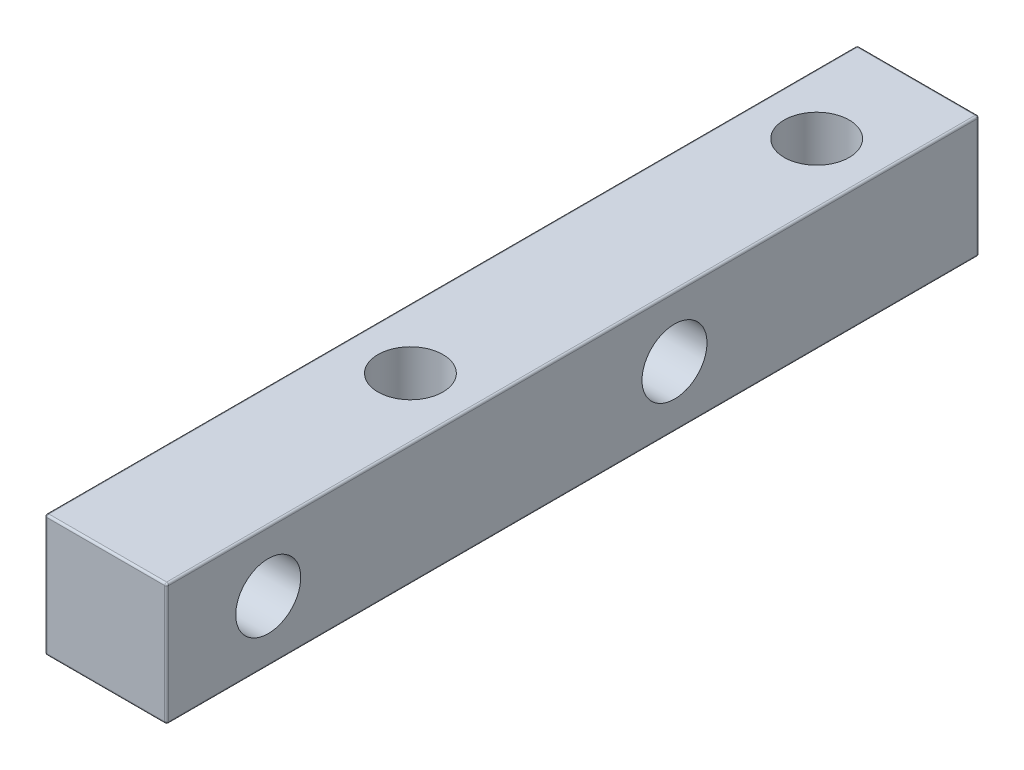
ISO-10303-21;
HEADER;
FILE_DESCRIPTION(('STEP AP214'),'2;1');
FILE_NAME('part.step','',(''),(''),'','','');
FILE_SCHEMA(('AUTOMOTIVE_DESIGN { 1 0 10303 214 1 1 1 1 }'));
ENDSEC;
DATA;
#1=APPLICATION_CONTEXT('core data for automotive mechanical design processes');
#2=APPLICATION_PROTOCOL_DEFINITION('international standard','automotive_design',2000,#1);
#3=PRODUCT_CONTEXT('',#1,'mechanical');
#4=PRODUCT('Part','Part','',(#3));
#5=PRODUCT_RELATED_PRODUCT_CATEGORY('part','',(#4));
#6=PRODUCT_DEFINITION_FORMATION('','',#4);
#7=PRODUCT_DEFINITION_CONTEXT('part definition',#1,'design');
#8=PRODUCT_DEFINITION('design','',#6,#7);
#9=PRODUCT_DEFINITION_SHAPE('','',#8);
#10=(LENGTH_UNIT() NAMED_UNIT(*) SI_UNIT(.MILLI.,.METRE.));
#11=(NAMED_UNIT(*) PLANE_ANGLE_UNIT() SI_UNIT($,.RADIAN.));
#12=(NAMED_UNIT(*) SI_UNIT($,.STERADIAN.) SOLID_ANGLE_UNIT());
#13=UNCERTAINTY_MEASURE_WITH_UNIT(LENGTH_MEASURE(1.E-05),#10,'distance_accuracy_value','');
#14=(GEOMETRIC_REPRESENTATION_CONTEXT(3) GLOBAL_UNCERTAINTY_ASSIGNED_CONTEXT((#13)) GLOBAL_UNIT_ASSIGNED_CONTEXT((#10,
#11,#12)) REPRESENTATION_CONTEXT('',''));
#15=CARTESIAN_POINT('',(0.,0.,0.));
#16=DIRECTION('',(0.,0.,1.));
#17=DIRECTION('',(1.,0.,0.));
#18=AXIS2_PLACEMENT_3D('',#15,#16,#17);
#19=CARTESIAN_POINT('',(3.,3.,40.));
#20=DIRECTION('',(-1.,0.,0.));
#21=DIRECTION('',(0.,-1.,0.));
#22=AXIS2_PLACEMENT_3D('',#19,#20,#21);
#23=PLANE('',#22);
#24=DIRECTION('',(0.,1.,0.));
#25=VECTOR('',#24,1.);
#26=CARTESIAN_POINT('',(3.,-3.,39.9));
#27=LINE('',#26,#25);
#28=CARTESIAN_POINT('',(3.,2.9,39.9));
#29=VERTEX_POINT('',#28);
#30=CARTESIAN_POINT('',(3.,-2.9,39.9));
#31=VERTEX_POINT('',#30);
#32=EDGE_CURVE('E162',#29,#31,#27,.F.);
#33=ORIENTED_EDGE('',*,*,#32,.T.);
#34=DIRECTION('',(0.,0.,-1.));
#35=VECTOR('',#34,1.);
#36=CARTESIAN_POINT('',(3.,-2.9,40.));
#37=LINE('',#36,#35);
#38=CARTESIAN_POINT('',(3.,-2.9,0.100000000000003));
#39=VERTEX_POINT('',#38);
#40=EDGE_CURVE('E167',#31,#39,#37,.T.);
#41=ORIENTED_EDGE('',*,*,#40,.T.);
#42=DIRECTION('',(0.,1.,0.));
#43=VECTOR('',#42,1.);
#44=CARTESIAN_POINT('',(3.,3.,0.100000000000003));
#45=LINE('',#44,#43);
#46=CARTESIAN_POINT('',(3.,2.9,0.100000000000003));
#47=VERTEX_POINT('',#46);
#48=EDGE_CURVE('E136',#39,#47,#45,.T.);
#49=ORIENTED_EDGE('',*,*,#48,.T.);
#50=DIRECTION('',(0.,0.,-1.));
#51=VECTOR('',#50,1.);
#52=CARTESIAN_POINT('',(3.,2.9,40.));
#53=LINE('',#52,#51);
#54=EDGE_CURVE('E156',#47,#29,#53,.F.);
#55=ORIENTED_EDGE('',*,*,#54,.T.);
#56=EDGE_LOOP('',(#33,#41,#49,#55));
#57=FACE_BOUND('',#56,.T.);
#58=CARTESIAN_POINT('',(3.,0.,15.));
#59=DIRECTION('',(-1.,0.,0.));
#60=DIRECTION('',(0.,-1.,0.));
#61=AXIS2_PLACEMENT_3D('',#58,#59,#60);
#62=CIRCLE('',#61,1.6);
#63=CARTESIAN_POINT('',(3.,-1.6,15.));
#64=VERTEX_POINT('',#63);
#65=EDGE_CURVE('E163',#64,#64,#62,.T.);
#66=ORIENTED_EDGE('',*,*,#65,.T.);
#67=EDGE_LOOP('',(#66));
#68=FACE_BOUND('',#67,.T.);
#69=CARTESIAN_POINT('',(3.,0.,35.));
#70=DIRECTION('',(-1.,0.,0.));
#71=DIRECTION('',(0.,-1.,0.));
#72=AXIS2_PLACEMENT_3D('',#69,#70,#71);
#73=CIRCLE('',#72,1.6);
#74=CARTESIAN_POINT('',(3.,-1.6,35.));
#75=VERTEX_POINT('',#74);
#76=EDGE_CURVE('E329',#75,#75,#73,.T.);
#77=ORIENTED_EDGE('',*,*,#76,.T.);
#78=EDGE_LOOP('',(#77));
#79=FACE_BOUND('',#78,.T.);
#80=ADVANCED_FACE('F38',(#57,#68,#79),#23,.F.);
#81=CARTESIAN_POINT('',(-3.,3.,40.));
#82=DIRECTION('',(0.,-1.,0.));
#83=DIRECTION('',(0.,0.,-1.));
#84=AXIS2_PLACEMENT_3D('',#81,#82,#83);
#85=PLANE('',#84);
#86=DIRECTION('',(-1.,0.,0.));
#87=VECTOR('',#86,1.);
#88=CARTESIAN_POINT('',(3.,3.,39.9));
#89=LINE('',#88,#87);
#90=CARTESIAN_POINT('',(-2.9,3.,39.9));
#91=VERTEX_POINT('',#90);
#92=CARTESIAN_POINT('',(2.9,3.,39.9));
#93=VERTEX_POINT('',#92);
#94=EDGE_CURVE('E190',#91,#93,#89,.F.);
#95=ORIENTED_EDGE('',*,*,#94,.T.);
#96=DIRECTION('',(0.,0.,-1.));
#97=VECTOR('',#96,1.);
#98=CARTESIAN_POINT('',(2.9,3.,40.));
#99=LINE('',#98,#97);
#100=CARTESIAN_POINT('',(2.9,3.,0.100000000000003));
#101=VERTEX_POINT('',#100);
#102=EDGE_CURVE('E197',#93,#101,#99,.T.);
#103=ORIENTED_EDGE('',*,*,#102,.T.);
#104=DIRECTION('',(-1.,0.,0.));
#105=VECTOR('',#104,1.);
#106=CARTESIAN_POINT('',(-3.,3.,0.100000000000003));
#107=LINE('',#106,#105);
#108=CARTESIAN_POINT('',(-2.9,3.,0.100000000000003));
#109=VERTEX_POINT('',#108);
#110=EDGE_CURVE('E193',#101,#109,#107,.T.);
#111=ORIENTED_EDGE('',*,*,#110,.T.);
#112=DIRECTION('',(0.,0.,-1.));
#113=VECTOR('',#112,1.);
#114=CARTESIAN_POINT('',(-2.9,3.,40.));
#115=LINE('',#114,#113);
#116=EDGE_CURVE('E187',#109,#91,#115,.F.);
#117=ORIENTED_EDGE('',*,*,#116,.T.);
#118=EDGE_LOOP('',(#95,#103,#111,#117));
#119=FACE_BOUND('',#118,.T.);
#120=CARTESIAN_POINT('',(0.,3.,5.));
#121=DIRECTION('',(0.,1.,0.));
#122=DIRECTION('',(0.,0.,1.));
#123=AXIS2_PLACEMENT_3D('',#120,#121,#122);
#124=CIRCLE('',#123,1.6);
#125=CARTESIAN_POINT('',(0.,3.,6.6));
#126=VERTEX_POINT('',#125);
#127=EDGE_CURVE('E316',#126,#126,#124,.T.);
#128=ORIENTED_EDGE('',*,*,#127,.F.);
#129=EDGE_LOOP('',(#128));
#130=FACE_BOUND('',#129,.T.);
#131=CARTESIAN_POINT('',(0.,3.,25.));
#132=DIRECTION('',(0.,1.,0.));
#133=DIRECTION('',(0.,0.,1.));
#134=AXIS2_PLACEMENT_3D('',#131,#132,#133);
#135=CIRCLE('',#134,1.6);
#136=CARTESIAN_POINT('',(0.,3.,26.6));
#137=VERTEX_POINT('',#136);
#138=EDGE_CURVE('E309',#137,#137,#135,.T.);
#139=ORIENTED_EDGE('',*,*,#138,.F.);
#140=EDGE_LOOP('',(#139));
#141=FACE_BOUND('',#140,.T.);
#142=ADVANCED_FACE('F365',(#119,#130,#141),#85,.F.);
#143=CARTESIAN_POINT('',(-3.,3.,40.));
#144=DIRECTION('',(1.,0.,0.));
#145=DIRECTION('',(0.,1.,0.));
#146=AXIS2_PLACEMENT_3D('',#143,#144,#145);
#147=PLANE('',#146);
#148=DIRECTION('',(0.,-1.,0.));
#149=VECTOR('',#148,1.);
#150=CARTESIAN_POINT('',(-3.,3.,0.100000000000003));
#151=LINE('',#150,#149);
#152=CARTESIAN_POINT('',(-3.,2.9,0.100000000000003));
#153=VERTEX_POINT('',#152);
#154=CARTESIAN_POINT('',(-3.,-2.9,0.100000000000003));
#155=VERTEX_POINT('',#154);
#156=EDGE_CURVE('E206',#153,#155,#151,.T.);
#157=ORIENTED_EDGE('',*,*,#156,.T.);
#158=DIRECTION('',(0.,0.,-1.));
#159=VECTOR('',#158,1.);
#160=CARTESIAN_POINT('',(-3.,-2.9,40.));
#161=LINE('',#160,#159);
#162=CARTESIAN_POINT('',(-3.,-2.9,39.9));
#163=VERTEX_POINT('',#162);
#164=EDGE_CURVE('E210',#155,#163,#161,.F.);
#165=ORIENTED_EDGE('',*,*,#164,.T.);
#166=DIRECTION('',(0.,-1.,0.));
#167=VECTOR('',#166,1.);
#168=CARTESIAN_POINT('',(-3.,3.,39.9));
#169=LINE('',#168,#167);
#170=CARTESIAN_POINT('',(-3.,2.9,39.9));
#171=VERTEX_POINT('',#170);
#172=EDGE_CURVE('E203',#163,#171,#169,.F.);
#173=ORIENTED_EDGE('',*,*,#172,.T.);
#174=DIRECTION('',(0.,0.,-1.));
#175=VECTOR('',#174,1.);
#176=CARTESIAN_POINT('',(-3.,2.9,40.));
#177=LINE('',#176,#175);
#178=EDGE_CURVE('E200',#171,#153,#177,.T.);
#179=ORIENTED_EDGE('',*,*,#178,.T.);
#180=EDGE_LOOP('',(#157,#165,#173,#179));
#181=FACE_BOUND('',#180,.T.);
#182=CARTESIAN_POINT('',(-3.,0.,15.));
#183=DIRECTION('',(-1.,0.,0.));
#184=DIRECTION('',(0.,-1.,0.));
#185=AXIS2_PLACEMENT_3D('',#182,#183,#184);
#186=CIRCLE('',#185,1.6);
#187=CARTESIAN_POINT('',(-3.,-1.6,15.));
#188=VERTEX_POINT('',#187);
#189=EDGE_CURVE('E325',#188,#188,#186,.T.);
#190=ORIENTED_EDGE('',*,*,#189,.F.);
#191=EDGE_LOOP('',(#190));
#192=FACE_BOUND('',#191,.T.);
#193=CARTESIAN_POINT('',(-3.,0.,35.));
#194=DIRECTION('',(-1.,0.,0.));
#195=DIRECTION('',(0.,-1.,0.));
#196=AXIS2_PLACEMENT_3D('',#193,#194,#195);
#197=CIRCLE('',#196,1.6);
#198=CARTESIAN_POINT('',(-3.,-1.6,35.));
#199=VERTEX_POINT('',#198);
#200=EDGE_CURVE('E330',#199,#199,#197,.T.);
#201=ORIENTED_EDGE('',*,*,#200,.F.);
#202=EDGE_LOOP('',(#201));
#203=FACE_BOUND('',#202,.T.);
#204=ADVANCED_FACE('F370',(#181,#192,#203),#147,.F.);
#205=CARTESIAN_POINT('',(-3.,-3.,40.));
#206=DIRECTION('',(0.,1.,0.));
#207=DIRECTION('',(0.,0.,1.));
#208=AXIS2_PLACEMENT_3D('',#205,#206,#207);
#209=PLANE('',#208);
#210=DIRECTION('',(1.,0.,0.));
#211=VECTOR('',#210,1.);
#212=CARTESIAN_POINT('',(-3.,-3.,0.100000000000003));
#213=LINE('',#212,#211);
#214=CARTESIAN_POINT('',(-2.9,-3.,0.100000000000003));
#215=VERTEX_POINT('',#214);
#216=CARTESIAN_POINT('',(2.9,-3.,0.100000000000003));
#217=VERTEX_POINT('',#216);
#218=EDGE_CURVE('E219',#215,#217,#213,.T.);
#219=ORIENTED_EDGE('',*,*,#218,.T.);
#220=DIRECTION('',(0.,0.,-1.));
#221=VECTOR('',#220,1.);
#222=CARTESIAN_POINT('',(2.9,-3.,40.));
#223=LINE('',#222,#221);
#224=CARTESIAN_POINT('',(2.9,-3.,39.9));
#225=VERTEX_POINT('',#224);
#226=EDGE_CURVE('E223',#217,#225,#223,.F.);
#227=ORIENTED_EDGE('',*,*,#226,.T.);
#228=DIRECTION('',(1.,0.,0.));
#229=VECTOR('',#228,1.);
#230=CARTESIAN_POINT('',(-3.,-3.,39.9));
#231=LINE('',#230,#229);
#232=CARTESIAN_POINT('',(-2.9,-3.,39.9));
#233=VERTEX_POINT('',#232);
#234=EDGE_CURVE('E216',#225,#233,#231,.F.);
#235=ORIENTED_EDGE('',*,*,#234,.T.);
#236=DIRECTION('',(0.,0.,-1.));
#237=VECTOR('',#236,1.);
#238=CARTESIAN_POINT('',(-2.9,-3.,40.));
#239=LINE('',#238,#237);
#240=EDGE_CURVE('E213',#233,#215,#239,.T.);
#241=ORIENTED_EDGE('',*,*,#240,.T.);
#242=EDGE_LOOP('',(#219,#227,#235,#241));
#243=FACE_BOUND('',#242,.T.);
#244=CARTESIAN_POINT('',(0.,-3.,5.));
#245=DIRECTION('',(0.,1.,0.));
#246=DIRECTION('',(0.,0.,1.));
#247=AXIS2_PLACEMENT_3D('',#244,#245,#246);
#248=CIRCLE('',#247,1.6);
#249=CARTESIAN_POINT('',(0.,-3.,6.6));
#250=VERTEX_POINT('',#249);
#251=EDGE_CURVE('E334',#250,#250,#248,.T.);
#252=ORIENTED_EDGE('',*,*,#251,.T.);
#253=EDGE_LOOP('',(#252));
#254=FACE_BOUND('',#253,.T.);
#255=CARTESIAN_POINT('',(0.,-3.,25.));
#256=DIRECTION('',(0.,1.,0.));
#257=DIRECTION('',(0.,0.,1.));
#258=AXIS2_PLACEMENT_3D('',#255,#256,#257);
#259=CIRCLE('',#258,1.6);
#260=CARTESIAN_POINT('',(0.,-3.,26.6));
#261=VERTEX_POINT('',#260);
#262=EDGE_CURVE('E322',#261,#261,#259,.T.);
#263=ORIENTED_EDGE('',*,*,#262,.T.);
#264=EDGE_LOOP('',(#263));
#265=FACE_BOUND('',#264,.T.);
#266=ADVANCED_FACE('F348',(#243,#254,#265),#209,.F.);
#267=CARTESIAN_POINT('',(0.,0.,40.));
#268=DIRECTION('',(0.,0.,1.));
#269=DIRECTION('',(1.,0.,0.));
#270=AXIS2_PLACEMENT_3D('',#267,#268,#269);
#271=PLANE('',#270);
#272=DIRECTION('',(1.,0.,0.));
#273=VECTOR('',#272,1.);
#274=CARTESIAN_POINT('',(3.,-2.9,40.));
#275=LINE('',#274,#273);
#276=CARTESIAN_POINT('',(-2.9,-2.9,40.));
#277=VERTEX_POINT('',#276);
#278=CARTESIAN_POINT('',(2.9,-2.9,40.));
#279=VERTEX_POINT('',#278);
#280=EDGE_CURVE('E226',#277,#279,#275,.T.);
#281=ORIENTED_EDGE('',*,*,#280,.T.);
#282=DIRECTION('',(0.,1.,0.));
#283=VECTOR('',#282,1.);
#284=CARTESIAN_POINT('',(2.9,3.,40.));
#285=LINE('',#284,#283);
#286=CARTESIAN_POINT('',(2.9,2.9,40.));
#287=VERTEX_POINT('',#286);
#288=EDGE_CURVE('E11',#279,#287,#285,.T.);
#289=ORIENTED_EDGE('',*,*,#288,.T.);
#290=DIRECTION('',(-1.,0.,0.));
#291=VECTOR('',#290,1.);
#292=CARTESIAN_POINT('',(-3.,2.9,40.));
#293=LINE('',#292,#291);
#294=CARTESIAN_POINT('',(-2.9,2.9,40.));
#295=VERTEX_POINT('',#294);
#296=EDGE_CURVE('E48',#287,#295,#293,.T.);
#297=ORIENTED_EDGE('',*,*,#296,.T.);
#298=DIRECTION('',(0.,-1.,0.));
#299=VECTOR('',#298,1.);
#300=CARTESIAN_POINT('',(-2.9,-3.,40.));
#301=LINE('',#300,#299);
#302=EDGE_CURVE('E229',#295,#277,#301,.T.);
#303=ORIENTED_EDGE('',*,*,#302,.T.);
#304=EDGE_LOOP('',(#281,#289,#297,#303));
#305=FACE_BOUND('',#304,.T.);
#306=ADVANCED_FACE('F446',(#305),#271,.T.);
#307=CARTESIAN_POINT('',(0.,0.,0.));
#308=DIRECTION('',(0.,0.,1.));
#309=DIRECTION('',(1.,0.,0.));
#310=AXIS2_PLACEMENT_3D('',#307,#308,#309);
#311=PLANE('',#310);
#312=DIRECTION('',(-1.,0.,0.));
#313=VECTOR('',#312,1.);
#314=CARTESIAN_POINT('',(0.,2.9,0.));
#315=LINE('',#314,#313);
#316=CARTESIAN_POINT('',(-2.9,2.9,0.));
#317=VERTEX_POINT('',#316);
#318=CARTESIAN_POINT('',(2.9,2.9,0.));
#319=VERTEX_POINT('',#318);
#320=EDGE_CURVE('E182',#317,#319,#315,.F.);
#321=ORIENTED_EDGE('',*,*,#320,.T.);
#322=DIRECTION('',(0.,1.,0.));
#323=VECTOR('',#322,1.);
#324=CARTESIAN_POINT('',(2.9,0.,0.));
#325=LINE('',#324,#323);
#326=CARTESIAN_POINT('',(2.9,-2.9,0.));
#327=VERTEX_POINT('',#326);
#328=EDGE_CURVE('E138',#319,#327,#325,.F.);
#329=ORIENTED_EDGE('',*,*,#328,.T.);
#330=DIRECTION('',(1.,0.,0.));
#331=VECTOR('',#330,1.);
#332=CARTESIAN_POINT('',(0.,-2.9,0.));
#333=LINE('',#332,#331);
#334=CARTESIAN_POINT('',(-2.9,-2.9,0.));
#335=VERTEX_POINT('',#334);
#336=EDGE_CURVE('E173',#327,#335,#333,.F.);
#337=ORIENTED_EDGE('',*,*,#336,.T.);
#338=DIRECTION('',(0.,-1.,0.));
#339=VECTOR('',#338,1.);
#340=CARTESIAN_POINT('',(-2.9,0.,0.));
#341=LINE('',#340,#339);
#342=EDGE_CURVE('E179',#335,#317,#341,.F.);
#343=ORIENTED_EDGE('',*,*,#342,.T.);
#344=EDGE_LOOP('',(#321,#329,#337,#343));
#345=FACE_BOUND('',#344,.T.);
#346=ADVANCED_FACE('F471',(#345),#311,.F.);
#347=CARTESIAN_POINT('',(37.,0.,35.));
#348=DIRECTION('',(-1.,0.,0.));
#349=DIRECTION('',(0.,-1.,0.));
#350=AXIS2_PLACEMENT_3D('',#347,#348,#349);
#351=CYLINDRICAL_SURFACE('',#350,1.6);
#352=ORIENTED_EDGE('',*,*,#200,.T.);
#353=EDGE_LOOP('',(#352));
#354=FACE_BOUND('',#353,.T.);
#355=ORIENTED_EDGE('',*,*,#76,.F.);
#356=EDGE_LOOP('',(#355));
#357=FACE_BOUND('',#356,.T.);
#358=ADVANCED_FACE('F478',(#354,#357),#351,.F.);
#359=CARTESIAN_POINT('',(37.,0.,15.));
#360=DIRECTION('',(-1.,0.,0.));
#361=DIRECTION('',(0.,-1.,0.));
#362=AXIS2_PLACEMENT_3D('',#359,#360,#361);
#363=CYLINDRICAL_SURFACE('',#362,1.6);
#364=ORIENTED_EDGE('',*,*,#189,.T.);
#365=EDGE_LOOP('',(#364));
#366=FACE_BOUND('',#365,.T.);
#367=ORIENTED_EDGE('',*,*,#65,.F.);
#368=EDGE_LOOP('',(#367));
#369=FACE_BOUND('',#368,.T.);
#370=ADVANCED_FACE('F362',(#366,#369),#363,.F.);
#371=CARTESIAN_POINT('',(0.,-37.,25.));
#372=DIRECTION('',(0.,1.,0.));
#373=DIRECTION('',(0.,0.,1.));
#374=AXIS2_PLACEMENT_3D('',#371,#372,#373);
#375=CYLINDRICAL_SURFACE('',#374,1.6);
#376=ORIENTED_EDGE('',*,*,#138,.T.);
#377=EDGE_LOOP('',(#376));
#378=FACE_BOUND('',#377,.T.);
#379=ORIENTED_EDGE('',*,*,#262,.F.);
#380=EDGE_LOOP('',(#379));
#381=FACE_BOUND('',#380,.T.);
#382=ADVANCED_FACE('F353',(#378,#381),#375,.F.);
#383=CARTESIAN_POINT('',(0.,-37.,5.));
#384=DIRECTION('',(0.,1.,0.));
#385=DIRECTION('',(0.,0.,1.));
#386=AXIS2_PLACEMENT_3D('',#383,#384,#385);
#387=CYLINDRICAL_SURFACE('',#386,1.6);
#388=ORIENTED_EDGE('',*,*,#127,.T.);
#389=EDGE_LOOP('',(#388));
#390=FACE_BOUND('',#389,.T.);
#391=ORIENTED_EDGE('',*,*,#251,.F.);
#392=EDGE_LOOP('',(#391));
#393=FACE_BOUND('',#392,.T.);
#394=ADVANCED_FACE('F351',(#390,#393),#387,.F.);
#395=CARTESIAN_POINT('',(-2.9,0.,39.9));
#396=DIRECTION('',(0.,1.,0.));
#397=DIRECTION('',(-1.,0.,0.));
#398=AXIS2_PLACEMENT_3D('',#395,#396,#397);
#399=CYLINDRICAL_SURFACE('',#398,0.1);
#400=CARTESIAN_POINT('',(-2.9,-2.9,39.9));
#401=DIRECTION('',(0.,-1.,0.));
#402=DIRECTION('',(0.,0.,-1.));
#403=AXIS2_PLACEMENT_3D('',#400,#401,#402);
#404=CIRCLE('',#403,0.1);
#405=EDGE_CURVE('E42',#277,#163,#404,.T.);
#406=ORIENTED_EDGE('',*,*,#405,.F.);
#407=ORIENTED_EDGE('',*,*,#302,.F.);
#408=CARTESIAN_POINT('',(-2.9,2.9,39.9));
#409=DIRECTION('',(0.,1.,0.));
#410=DIRECTION('',(0.,0.,1.));
#411=AXIS2_PLACEMENT_3D('',#408,#409,#410);
#412=CIRCLE('',#411,0.1);
#413=EDGE_CURVE('E300',#171,#295,#412,.T.);
#414=ORIENTED_EDGE('',*,*,#413,.F.);
#415=ORIENTED_EDGE('',*,*,#172,.F.);
#416=EDGE_LOOP('',(#406,#407,#414,#415));
#417=FACE_BOUND('',#416,.T.);
#418=ADVANCED_FACE('F40',(#417),#399,.T.);
#419=CARTESIAN_POINT('',(-2.9,-2.9,39.9));
#420=DIRECTION('',(-1.,0.,0.));
#421=DIRECTION('',(0.,0.,1.));
#422=AXIS2_PLACEMENT_3D('',#419,#420,#421);
#423=SPHERICAL_SURFACE('',#422,0.1);
#424=CARTESIAN_POINT('',(-2.9,-2.9,39.9));
#425=DIRECTION('',(-1.,0.,0.));
#426=DIRECTION('',(0.,0.,1.));
#427=AXIS2_PLACEMENT_3D('',#424,#425,#426);
#428=CIRCLE('',#427,0.1);
#429=EDGE_CURVE('E293',#277,#233,#428,.F.);
#430=ORIENTED_EDGE('',*,*,#429,.F.);
#431=ORIENTED_EDGE('',*,*,#405,.T.);
#432=CARTESIAN_POINT('',(-2.9,-2.9,39.9));
#433=DIRECTION('',(0.,0.,1.));
#434=DIRECTION('',(1.,0.,0.));
#435=AXIS2_PLACEMENT_3D('',#432,#433,#434);
#436=CIRCLE('',#435,0.1);
#437=EDGE_CURVE('E297',#233,#163,#436,.F.);
#438=ORIENTED_EDGE('',*,*,#437,.F.);
#439=EDGE_LOOP('',(#430,#431,#438));
#440=FACE_BOUND('',#439,.T.);
#441=ADVANCED_FACE('F360',(#440),#423,.T.);
#442=CARTESIAN_POINT('',(-2.9,2.9,39.9));
#443=DIRECTION('',(0.,0.,1.));
#444=DIRECTION('',(1.,0.,0.));
#445=AXIS2_PLACEMENT_3D('',#442,#443,#444);
#446=SPHERICAL_SURFACE('',#445,0.1);
#447=CARTESIAN_POINT('',(-2.9,2.9,39.9));
#448=DIRECTION('',(0.,0.,1.));
#449=DIRECTION('',(1.,0.,0.));
#450=AXIS2_PLACEMENT_3D('',#447,#448,#449);
#451=CIRCLE('',#450,0.1);
#452=EDGE_CURVE('E285',#171,#91,#451,.F.);
#453=ORIENTED_EDGE('',*,*,#452,.F.);
#454=ORIENTED_EDGE('',*,*,#413,.T.);
#455=CARTESIAN_POINT('',(-2.9,2.9,39.9));
#456=DIRECTION('',(-1.,0.,0.));
#457=DIRECTION('',(0.,0.,1.));
#458=AXIS2_PLACEMENT_3D('',#455,#456,#457);
#459=CIRCLE('',#458,0.1);
#460=EDGE_CURVE('E289',#91,#295,#459,.F.);
#461=ORIENTED_EDGE('',*,*,#460,.F.);
#462=EDGE_LOOP('',(#453,#454,#461));
#463=FACE_BOUND('',#462,.T.);
#464=ADVANCED_FACE('F435',(#463),#446,.T.);
#465=CARTESIAN_POINT('',(-2.9,-2.9,40.));
#466=DIRECTION('',(0.,0.,-1.));
#467=DIRECTION('',(-1.,0.,0.));
#468=AXIS2_PLACEMENT_3D('',#465,#466,#467);
#469=CYLINDRICAL_SURFACE('',#468,0.1);
#470=ORIENTED_EDGE('',*,*,#437,.T.);
#471=ORIENTED_EDGE('',*,*,#164,.F.);
#472=CARTESIAN_POINT('',(-2.9,-2.9,0.100000000000003));
#473=DIRECTION('',(0.,0.,-1.));
#474=DIRECTION('',(-1.,0.,0.));
#475=AXIS2_PLACEMENT_3D('',#472,#473,#474);
#476=CIRCLE('',#475,0.1);
#477=EDGE_CURVE('E278',#215,#155,#476,.T.);
#478=ORIENTED_EDGE('',*,*,#477,.F.);
#479=ORIENTED_EDGE('',*,*,#240,.F.);
#480=EDGE_LOOP('',(#470,#471,#478,#479));
#481=FACE_BOUND('',#480,.T.);
#482=ADVANCED_FACE('F431',(#481),#469,.T.);
#483=CARTESIAN_POINT('',(0.,-2.9,39.9));
#484=DIRECTION('',(-1.,0.,0.));
#485=DIRECTION('',(0.,0.,1.));
#486=AXIS2_PLACEMENT_3D('',#483,#484,#485);
#487=CYLINDRICAL_SURFACE('',#486,0.1);
#488=ORIENTED_EDGE('',*,*,#429,.T.);
#489=ORIENTED_EDGE('',*,*,#234,.F.);
#490=CARTESIAN_POINT('',(2.9,-2.9,39.9));
#491=DIRECTION('',(1.,0.,0.));
#492=DIRECTION('',(0.,0.,-1.));
#493=AXIS2_PLACEMENT_3D('',#490,#491,#492);
#494=CIRCLE('',#493,0.1);
#495=EDGE_CURVE('E274',#279,#225,#494,.T.);
#496=ORIENTED_EDGE('',*,*,#495,.F.);
#497=ORIENTED_EDGE('',*,*,#280,.F.);
#498=EDGE_LOOP('',(#488,#489,#496,#497));
#499=FACE_BOUND('',#498,.T.);
#500=ADVANCED_FACE('F427',(#499),#487,.T.);
#501=CARTESIAN_POINT('',(2.9,0.,39.9));
#502=DIRECTION('',(0.,-1.,0.));
#503=DIRECTION('',(1.,0.,0.));
#504=AXIS2_PLACEMENT_3D('',#501,#502,#503);
#505=CYLINDRICAL_SURFACE('',#504,0.1);
#506=CARTESIAN_POINT('',(2.9,2.9,39.9));
#507=DIRECTION('',(0.,1.,0.));
#508=DIRECTION('',(0.,0.,1.));
#509=AXIS2_PLACEMENT_3D('',#506,#507,#508);
#510=CIRCLE('',#509,0.1);
#511=EDGE_CURVE('E267',#287,#29,#510,.T.);
#512=ORIENTED_EDGE('',*,*,#511,.F.);
#513=ORIENTED_EDGE('',*,*,#288,.F.);
#514=CARTESIAN_POINT('',(2.9,-2.9,39.9));
#515=DIRECTION('',(0.,-1.,0.));
#516=DIRECTION('',(0.,0.,-1.));
#517=AXIS2_PLACEMENT_3D('',#514,#515,#516);
#518=CIRCLE('',#517,0.1);
#519=EDGE_CURVE('E270',#31,#279,#518,.T.);
#520=ORIENTED_EDGE('',*,*,#519,.F.);
#521=ORIENTED_EDGE('',*,*,#32,.F.);
#522=EDGE_LOOP('',(#512,#513,#520,#521));
#523=FACE_BOUND('',#522,.T.);
#524=ADVANCED_FACE('F423',(#523),#505,.T.);
#525=CARTESIAN_POINT('',(0.,2.9,39.9));
#526=DIRECTION('',(1.,0.,0.));
#527=DIRECTION('',(0.,0.,-1.));
#528=AXIS2_PLACEMENT_3D('',#525,#526,#527);
#529=CYLINDRICAL_SURFACE('',#528,0.1);
#530=ORIENTED_EDGE('',*,*,#460,.T.);
#531=ORIENTED_EDGE('',*,*,#296,.F.);
#532=CARTESIAN_POINT('',(2.9,2.9,39.9));
#533=DIRECTION('',(1.,0.,0.));
#534=DIRECTION('',(0.,0.,-1.));
#535=AXIS2_PLACEMENT_3D('',#532,#533,#534);
#536=CIRCLE('',#535,0.1);
#537=EDGE_CURVE('E56',#93,#287,#536,.T.);
#538=ORIENTED_EDGE('',*,*,#537,.F.);
#539=ORIENTED_EDGE('',*,*,#94,.F.);
#540=EDGE_LOOP('',(#530,#531,#538,#539));
#541=FACE_BOUND('',#540,.T.);
#542=ADVANCED_FACE('F419',(#541),#529,.T.);
#543=CARTESIAN_POINT('',(-2.9,2.9,40.));
#544=DIRECTION('',(0.,0.,-1.));
#545=DIRECTION('',(-1.,0.,0.));
#546=AXIS2_PLACEMENT_3D('',#543,#544,#545);
#547=CYLINDRICAL_SURFACE('',#546,0.1);
#548=ORIENTED_EDGE('',*,*,#452,.T.);
#549=ORIENTED_EDGE('',*,*,#116,.F.);
#550=CARTESIAN_POINT('',(-2.9,2.9,0.100000000000003));
#551=DIRECTION('',(0.,0.,-1.));
#552=DIRECTION('',(-1.,0.,0.));
#553=AXIS2_PLACEMENT_3D('',#550,#551,#552);
#554=CIRCLE('',#553,0.1);
#555=EDGE_CURVE('E261',#153,#109,#554,.T.);
#556=ORIENTED_EDGE('',*,*,#555,.F.);
#557=ORIENTED_EDGE('',*,*,#178,.F.);
#558=EDGE_LOOP('',(#548,#549,#556,#557));
#559=FACE_BOUND('',#558,.T.);
#560=ADVANCED_FACE('F415',(#559),#547,.T.);
#561=CARTESIAN_POINT('',(-2.9,3.,0.100000000000003));
#562=DIRECTION('',(0.,-1.,0.));
#563=DIRECTION('',(1.,0.,0.));
#564=AXIS2_PLACEMENT_3D('',#561,#562,#563);
#565=CYLINDRICAL_SURFACE('',#564,0.1);
#566=CARTESIAN_POINT('',(-2.9,-2.9,0.100000000000003));
#567=DIRECTION('',(0.,-1.,0.));
#568=DIRECTION('',(0.,0.,-1.));
#569=AXIS2_PLACEMENT_3D('',#566,#567,#568);
#570=CIRCLE('',#569,0.1);
#571=EDGE_CURVE('E281',#155,#335,#570,.T.);
#572=ORIENTED_EDGE('',*,*,#571,.F.);
#573=ORIENTED_EDGE('',*,*,#156,.F.);
#574=CARTESIAN_POINT('',(-2.9,2.9,0.1));
#575=DIRECTION('',(0.,1.,0.));
#576=DIRECTION('',(0.,0.,1.));
#577=AXIS2_PLACEMENT_3D('',#574,#575,#576);
#578=CIRCLE('',#577,0.1);
#579=EDGE_CURVE('E257',#317,#153,#578,.T.);
#580=ORIENTED_EDGE('',*,*,#579,.F.);
#581=ORIENTED_EDGE('',*,*,#342,.F.);
#582=EDGE_LOOP('',(#572,#573,#580,#581));
#583=FACE_BOUND('',#582,.T.);
#584=ADVANCED_FACE('F411',(#583),#565,.T.);
#585=CARTESIAN_POINT('',(-2.9,-2.9,0.1));
#586=DIRECTION('',(-1.,0.,0.));
#587=DIRECTION('',(0.,0.,1.));
#588=AXIS2_PLACEMENT_3D('',#585,#586,#587);
#589=SPHERICAL_SURFACE('',#588,0.1);
#590=ORIENTED_EDGE('',*,*,#477,.T.);
#591=ORIENTED_EDGE('',*,*,#571,.T.);
#592=CARTESIAN_POINT('',(-2.9,-2.9,0.1));
#593=DIRECTION('',(-1.,0.,0.));
#594=DIRECTION('',(0.,0.,1.));
#595=AXIS2_PLACEMENT_3D('',#592,#593,#594);
#596=CIRCLE('',#595,0.1);
#597=EDGE_CURVE('E253',#215,#335,#596,.F.);
#598=ORIENTED_EDGE('',*,*,#597,.F.);
#599=EDGE_LOOP('',(#590,#591,#598));
#600=FACE_BOUND('',#599,.T.);
#601=ADVANCED_FACE('F407',(#600),#589,.T.);
#602=CARTESIAN_POINT('',(2.9,-2.9,39.9));
#603=DIRECTION('',(0.,0.,1.));
#604=DIRECTION('',(1.,0.,0.));
#605=AXIS2_PLACEMENT_3D('',#602,#603,#604);
#606=SPHERICAL_SURFACE('',#605,0.1);
#607=ORIENTED_EDGE('',*,*,#519,.T.);
#608=ORIENTED_EDGE('',*,*,#495,.T.);
#609=CARTESIAN_POINT('',(2.9,-2.9,39.9));
#610=DIRECTION('',(0.,0.,1.));
#611=DIRECTION('',(1.,0.,0.));
#612=AXIS2_PLACEMENT_3D('',#609,#610,#611);
#613=CIRCLE('',#612,0.1);
#614=EDGE_CURVE('E249',#31,#225,#613,.F.);
#615=ORIENTED_EDGE('',*,*,#614,.F.);
#616=EDGE_LOOP('',(#607,#608,#615));
#617=FACE_BOUND('',#616,.T.);
#618=ADVANCED_FACE('F404',(#617),#606,.T.);
#619=CARTESIAN_POINT('',(2.9,2.9,39.9));
#620=DIRECTION('',(0.,0.,1.));
#621=DIRECTION('',(1.,0.,0.));
#622=AXIS2_PLACEMENT_3D('',#619,#620,#621);
#623=SPHERICAL_SURFACE('',#622,0.1);
#624=ORIENTED_EDGE('',*,*,#537,.T.);
#625=ORIENTED_EDGE('',*,*,#511,.T.);
#626=CARTESIAN_POINT('',(2.9,2.9,39.9));
#627=DIRECTION('',(0.,0.,1.));
#628=DIRECTION('',(1.,0.,0.));
#629=AXIS2_PLACEMENT_3D('',#626,#627,#628);
#630=CIRCLE('',#629,0.1);
#631=EDGE_CURVE('E158',#93,#29,#630,.F.);
#632=ORIENTED_EDGE('',*,*,#631,.F.);
#633=EDGE_LOOP('',(#624,#625,#632));
#634=FACE_BOUND('',#633,.T.);
#635=ADVANCED_FACE('F400',(#634),#623,.T.);
#636=CARTESIAN_POINT('',(-2.9,2.9,0.1));
#637=DIRECTION('',(-1.,0.,0.));
#638=DIRECTION('',(0.,0.,1.));
#639=AXIS2_PLACEMENT_3D('',#636,#637,#638);
#640=SPHERICAL_SURFACE('',#639,0.1);
#641=ORIENTED_EDGE('',*,*,#579,.T.);
#642=ORIENTED_EDGE('',*,*,#555,.T.);
#643=CARTESIAN_POINT('',(-2.9,2.9,0.100000000000003));
#644=DIRECTION('',(-1.,0.,0.));
#645=DIRECTION('',(0.,0.,1.));
#646=AXIS2_PLACEMENT_3D('',#643,#644,#645);
#647=CIRCLE('',#646,0.1);
#648=EDGE_CURVE('E244',#317,#109,#647,.F.);
#649=ORIENTED_EDGE('',*,*,#648,.F.);
#650=EDGE_LOOP('',(#641,#642,#649));
#651=FACE_BOUND('',#650,.T.);
#652=ADVANCED_FACE('F396',(#651),#640,.T.);
#653=CARTESIAN_POINT('',(-3.,-2.9,0.100000000000003));
#654=DIRECTION('',(1.,0.,0.));
#655=DIRECTION('',(0.,0.,-1.));
#656=AXIS2_PLACEMENT_3D('',#653,#654,#655);
#657=CYLINDRICAL_SURFACE('',#656,0.1);
#658=ORIENTED_EDGE('',*,*,#597,.T.);
#659=ORIENTED_EDGE('',*,*,#336,.F.);
#660=CARTESIAN_POINT('',(2.9,-2.9,0.100000000000003));
#661=DIRECTION('',(1.,0.,0.));
#662=DIRECTION('',(0.,0.,-1.));
#663=AXIS2_PLACEMENT_3D('',#660,#661,#662);
#664=CIRCLE('',#663,0.1);
#665=EDGE_CURVE('E240',#217,#327,#664,.T.);
#666=ORIENTED_EDGE('',*,*,#665,.F.);
#667=ORIENTED_EDGE('',*,*,#218,.F.);
#668=EDGE_LOOP('',(#658,#659,#666,#667));
#669=FACE_BOUND('',#668,.T.);
#670=ADVANCED_FACE('F392',(#669),#657,.T.);
#671=CARTESIAN_POINT('',(2.9,-2.9,40.));
#672=DIRECTION('',(0.,0.,-1.));
#673=DIRECTION('',(-1.,0.,0.));
#674=AXIS2_PLACEMENT_3D('',#671,#672,#673);
#675=CYLINDRICAL_SURFACE('',#674,0.1);
#676=ORIENTED_EDGE('',*,*,#614,.T.);
#677=ORIENTED_EDGE('',*,*,#226,.F.);
#678=CARTESIAN_POINT('',(2.9,-2.9,0.100000000000003));
#679=DIRECTION('',(0.,0.,-1.));
#680=DIRECTION('',(-1.,0.,0.));
#681=AXIS2_PLACEMENT_3D('',#678,#679,#680);
#682=CIRCLE('',#681,0.1);
#683=EDGE_CURVE('E153',#39,#217,#682,.T.);
#684=ORIENTED_EDGE('',*,*,#683,.F.);
#685=ORIENTED_EDGE('',*,*,#40,.F.);
#686=EDGE_LOOP('',(#676,#677,#684,#685));
#687=FACE_BOUND('',#686,.T.);
#688=ADVANCED_FACE('F389',(#687),#675,.T.);
#689=CARTESIAN_POINT('',(2.9,2.9,40.));
#690=DIRECTION('',(0.,0.,-1.));
#691=DIRECTION('',(-1.,0.,0.));
#692=AXIS2_PLACEMENT_3D('',#689,#690,#691);
#693=CYLINDRICAL_SURFACE('',#692,0.1);
#694=ORIENTED_EDGE('',*,*,#631,.T.);
#695=ORIENTED_EDGE('',*,*,#54,.F.);
#696=CARTESIAN_POINT('',(2.9,2.9,0.100000000000003));
#697=DIRECTION('',(0.,0.,-1.));
#698=DIRECTION('',(-1.,0.,0.));
#699=AXIS2_PLACEMENT_3D('',#696,#697,#698);
#700=CIRCLE('',#699,0.1);
#701=EDGE_CURVE('E145',#101,#47,#700,.T.);
#702=ORIENTED_EDGE('',*,*,#701,.F.);
#703=ORIENTED_EDGE('',*,*,#102,.F.);
#704=EDGE_LOOP('',(#694,#695,#702,#703));
#705=FACE_BOUND('',#704,.T.);
#706=ADVANCED_FACE('F157',(#705),#693,.T.);
#707=CARTESIAN_POINT('',(-3.,2.9,0.100000000000003));
#708=DIRECTION('',(-1.,0.,0.));
#709=DIRECTION('',(0.,0.,1.));
#710=AXIS2_PLACEMENT_3D('',#707,#708,#709);
#711=CYLINDRICAL_SURFACE('',#710,0.1);
#712=ORIENTED_EDGE('',*,*,#648,.T.);
#713=ORIENTED_EDGE('',*,*,#110,.F.);
#714=CARTESIAN_POINT('',(2.9,2.9,0.1));
#715=DIRECTION('',(1.,0.,0.));
#716=DIRECTION('',(0.,1.,0.));
#717=AXIS2_PLACEMENT_3D('',#714,#715,#716);
#718=CIRCLE('',#717,0.1);
#719=EDGE_CURVE('E149',#319,#101,#718,.T.);
#720=ORIENTED_EDGE('',*,*,#719,.F.);
#721=ORIENTED_EDGE('',*,*,#320,.F.);
#722=EDGE_LOOP('',(#712,#713,#720,#721));
#723=FACE_BOUND('',#722,.T.);
#724=ADVANCED_FACE('F382',(#723),#711,.T.);
#725=CARTESIAN_POINT('',(2.9,-2.9,0.1));
#726=DIRECTION('',(0.,-1.,0.));
#727=DIRECTION('',(0.,0.,-1.));
#728=AXIS2_PLACEMENT_3D('',#725,#726,#727);
#729=SPHERICAL_SURFACE('',#728,0.1);
#730=ORIENTED_EDGE('',*,*,#683,.T.);
#731=ORIENTED_EDGE('',*,*,#665,.T.);
#732=CARTESIAN_POINT('',(2.9,-2.9,0.1));
#733=DIRECTION('',(0.,-1.,0.));
#734=DIRECTION('',(1.,0.,0.));
#735=AXIS2_PLACEMENT_3D('',#732,#733,#734);
#736=CIRCLE('',#735,0.1);
#737=EDGE_CURVE('E142',#39,#327,#736,.F.);
#738=ORIENTED_EDGE('',*,*,#737,.F.);
#739=EDGE_LOOP('',(#730,#731,#738));
#740=FACE_BOUND('',#739,.T.);
#741=ADVANCED_FACE('F379',(#740),#729,.T.);
#742=CARTESIAN_POINT('',(2.9,2.9,0.1));
#743=DIRECTION('',(0.,1.,0.));
#744=DIRECTION('',(0.,0.,1.));
#745=AXIS2_PLACEMENT_3D('',#742,#743,#744);
#746=SPHERICAL_SURFACE('',#745,0.1);
#747=ORIENTED_EDGE('',*,*,#719,.T.);
#748=ORIENTED_EDGE('',*,*,#701,.T.);
#749=CARTESIAN_POINT('',(2.9,2.9,0.100000000000003));
#750=DIRECTION('',(0.,1.,0.));
#751=DIRECTION('',(0.,0.,1.));
#752=AXIS2_PLACEMENT_3D('',#749,#750,#751);
#753=CIRCLE('',#752,0.1);
#754=EDGE_CURVE('E132',#319,#47,#753,.F.);
#755=ORIENTED_EDGE('',*,*,#754,.F.);
#756=EDGE_LOOP('',(#747,#748,#755));
#757=FACE_BOUND('',#756,.T.);
#758=ADVANCED_FACE('F147',(#757),#746,.T.);
#759=CARTESIAN_POINT('',(2.9,3.,0.100000000000003));
#760=DIRECTION('',(0.,1.,0.));
#761=DIRECTION('',(-1.,0.,0.));
#762=AXIS2_PLACEMENT_3D('',#759,#760,#761);
#763=CYLINDRICAL_SURFACE('',#762,0.1);
#764=ORIENTED_EDGE('',*,*,#737,.T.);
#765=ORIENTED_EDGE('',*,*,#328,.F.);
#766=ORIENTED_EDGE('',*,*,#754,.T.);
#767=ORIENTED_EDGE('',*,*,#48,.F.);
#768=EDGE_LOOP('',(#764,#765,#766,#767));
#769=FACE_BOUND('',#768,.T.);
#770=ADVANCED_FACE('F134',(#769),#763,.T.);
#771=CLOSED_SHELL('',(#80,#142,#204,#266,#306,#346,#358,#370,#382,#394,#418,#441,#464,#482,#500,
#524,#542,#560,#584,#601,#618,#635,#652,#670,#688,#706,#724,#741,#758,#770));
#772=MANIFOLD_SOLID_BREP('B2',#771);
#773=ADVANCED_BREP_SHAPE_REPRESENTATION('',(#18,#772),#14);
#774=SHAPE_DEFINITION_REPRESENTATION(#9,#773);
ENDSEC;
END-ISO-10303-21;
